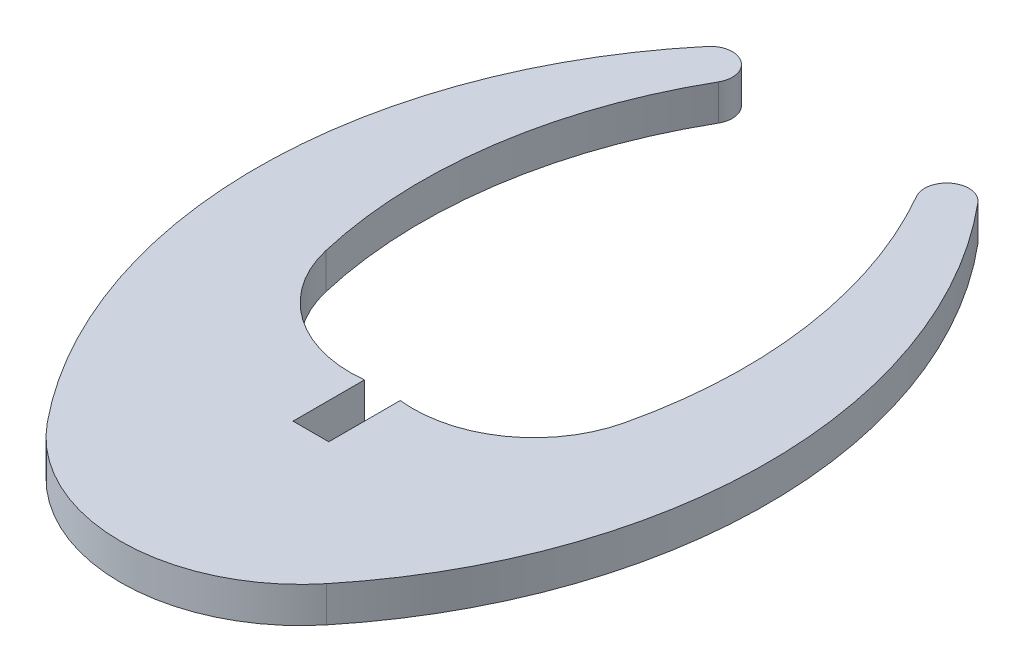
ISO-10303-21;
HEADER;
FILE_DESCRIPTION(('STEP AP214'),'2;1');
FILE_NAME('part.step','',(''),(''),'','','');
FILE_SCHEMA(('AUTOMOTIVE_DESIGN { 1 0 10303 214 1 1 1 1 }'));
ENDSEC;
DATA;
#1=APPLICATION_CONTEXT('core data for automotive mechanical design processes');
#2=APPLICATION_PROTOCOL_DEFINITION('international standard','automotive_design',2000,#1);
#3=PRODUCT_CONTEXT('',#1,'mechanical');
#4=PRODUCT('Part','Part','',(#3));
#5=PRODUCT_RELATED_PRODUCT_CATEGORY('part','',(#4));
#6=PRODUCT_DEFINITION_FORMATION('','',#4);
#7=PRODUCT_DEFINITION_CONTEXT('part definition',#1,'design');
#8=PRODUCT_DEFINITION('design','',#6,#7);
#9=PRODUCT_DEFINITION_SHAPE('','',#8);
#10=(LENGTH_UNIT() NAMED_UNIT(*) SI_UNIT(.MILLI.,.METRE.));
#11=(NAMED_UNIT(*) PLANE_ANGLE_UNIT() SI_UNIT($,.RADIAN.));
#12=(NAMED_UNIT(*) SI_UNIT($,.STERADIAN.) SOLID_ANGLE_UNIT());
#13=UNCERTAINTY_MEASURE_WITH_UNIT(LENGTH_MEASURE(1.E-05),#10,'distance_accuracy_value','');
#14=(GEOMETRIC_REPRESENTATION_CONTEXT(3) GLOBAL_UNCERTAINTY_ASSIGNED_CONTEXT((#13)) GLOBAL_UNIT_ASSIGNED_CONTEXT((#10,
#11,#12)) REPRESENTATION_CONTEXT('',''));
#15=CARTESIAN_POINT('',(0.,0.,0.));
#16=DIRECTION('',(0.,0.,1.));
#17=DIRECTION('',(1.,0.,0.));
#18=AXIS2_PLACEMENT_3D('',#15,#16,#17);
#19=CARTESIAN_POINT('',(-41945.935572,3.,-18357.862013));
#20=DIRECTION('',(-0.999999945672354,0.,0.000329629018519871));
#21=DIRECTION('',(0.000329629018519871,0.,0.999999945672354));
#22=AXIS2_PLACEMENT_3D('',#19,#20,#21);
#23=PLANE('',#22);
#24=DIRECTION('',(-0.000329629018519871,0.,-0.999999945672354));
#25=VECTOR('',#24,1.);
#26=CARTESIAN_POINT('',(-41945.935572,0.,-18357.862013));
#27=LINE('',#26,#25);
#28=CARTESIAN_POINT('',(-41945.933594,0.,-18351.861328));
#29=VERTEX_POINT('',#28);
#30=CARTESIAN_POINT('',(-41945.935572,0.,-18357.862013));
#31=VERTEX_POINT('',#30);
#32=EDGE_CURVE('E155',#29,#31,#27,.T.);
#33=ORIENTED_EDGE('',*,*,#32,.T.);
#34=DIRECTION('',(0.,-1.,0.));
#35=VECTOR('',#34,1.);
#36=CARTESIAN_POINT('',(-41945.935572,3.,-18357.862013));
#37=LINE('',#36,#35);
#38=CARTESIAN_POINT('',(-41945.935572,3.,-18357.862013));
#39=VERTEX_POINT('',#38);
#40=EDGE_CURVE('E11',#39,#31,#37,.T.);
#41=ORIENTED_EDGE('',*,*,#40,.F.);
#42=DIRECTION('',(-0.000329629018519871,0.,-0.999999945672354));
#43=VECTOR('',#42,1.);
#44=CARTESIAN_POINT('',(-41945.935572,3.,-18357.862013));
#45=LINE('',#44,#43);
#46=CARTESIAN_POINT('',(-41945.933594,3.,-18351.861328));
#47=VERTEX_POINT('',#46);
#48=EDGE_CURVE('E177',#47,#39,#45,.T.);
#49=ORIENTED_EDGE('',*,*,#48,.F.);
#50=DIRECTION('',(0.,-1.,0.));
#51=VECTOR('',#50,1.);
#52=CARTESIAN_POINT('',(-41945.933594,3.,-18351.861328));
#53=LINE('',#52,#51);
#54=EDGE_CURVE('E151',#47,#29,#53,.T.);
#55=ORIENTED_EDGE('',*,*,#54,.T.);
#56=EDGE_LOOP('',(#33,#41,#49,#55));
#57=FACE_BOUND('',#56,.T.);
#58=ADVANCED_FACE('F35',(#57),#23,.F.);
#59=CARTESIAN_POINT('',(-41947.0649977275,3.,-18367.9618966226));
#60=DIRECTION('',(0.,-1.,0.));
#61=DIRECTION('',(0.,0.,-1.));
#62=AXIS2_PLACEMENT_3D('',#59,#60,#61);
#63=CYLINDRICAL_SURFACE('',#62,10.1628367922054);
#64=CARTESIAN_POINT('',(-41947.0649977275,0.,-18367.9618966226));
#65=DIRECTION('',(0.,-1.,0.));
#66=DIRECTION('',(0.,0.,1.));
#67=AXIS2_PLACEMENT_3D('',#64,#65,#66);
#68=CIRCLE('',#67,10.1628367922054);
#69=CARTESIAN_POINT('',(-41956.960626,0.,-18365.646774));
#70=VERTEX_POINT('',#69);
#71=EDGE_CURVE('E158',#31,#70,#68,.T.);
#72=ORIENTED_EDGE('',*,*,#71,.T.);
#73=DIRECTION('',(0.,-1.,0.));
#74=VECTOR('',#73,1.);
#75=CARTESIAN_POINT('',(-41956.960626,3.,-18365.646774));
#76=LINE('',#75,#74);
#77=CARTESIAN_POINT('',(-41956.960626,3.,-18365.646774));
#78=VERTEX_POINT('',#77);
#79=EDGE_CURVE('E43',#78,#70,#76,.T.);
#80=ORIENTED_EDGE('',*,*,#79,.F.);
#81=CARTESIAN_POINT('',(-41947.0649977275,3.,-18367.9618966226));
#82=DIRECTION('',(0.,-1.,0.));
#83=DIRECTION('',(0.,0.,1.));
#84=AXIS2_PLACEMENT_3D('',#81,#82,#83);
#85=CIRCLE('',#84,10.1628367922054);
#86=EDGE_CURVE('E106',#39,#78,#85,.T.);
#87=ORIENTED_EDGE('',*,*,#86,.F.);
#88=ORIENTED_EDGE('',*,*,#40,.T.);
#89=EDGE_LOOP('',(#72,#80,#87,#88));
#90=FACE_BOUND('',#89,.T.);
#91=ADVANCED_FACE('F255',(#90),#63,.F.);
#92=CARTESIAN_POINT('',(-41918.4104897131,3.,-18374.6735051959));
#93=DIRECTION('',(0.,-1.,0.));
#94=DIRECTION('',(0.,0.,-1.));
#95=AXIS2_PLACEMENT_3D('',#92,#93,#94);
#96=CYLINDRICAL_SURFACE('',#95,39.592864051801);
#97=CARTESIAN_POINT('',(-41918.4104897131,0.,-18374.6735051959));
#98=DIRECTION('',(0.,-1.,0.));
#99=DIRECTION('',(0.,0.,1.));
#100=AXIS2_PLACEMENT_3D('',#97,#98,#99);
#101=CIRCLE('',#100,39.592864051801);
#102=CARTESIAN_POINT('',(-41952.74617,0.,-18394.387864));
#103=VERTEX_POINT('',#102);
#104=EDGE_CURVE('E160',#70,#103,#101,.T.);
#105=ORIENTED_EDGE('',*,*,#104,.T.);
#106=DIRECTION('',(0.,-1.,0.));
#107=VECTOR('',#106,1.);
#108=CARTESIAN_POINT('',(-41952.74617,3.,-18394.387864));
#109=LINE('',#108,#107);
#110=CARTESIAN_POINT('',(-41952.74617,3.,-18394.387864));
#111=VERTEX_POINT('',#110);
#112=EDGE_CURVE('E196',#111,#103,#109,.T.);
#113=ORIENTED_EDGE('',*,*,#112,.F.);
#114=CARTESIAN_POINT('',(-41918.4104897131,3.,-18374.6735051959));
#115=DIRECTION('',(0.,-1.,0.));
#116=DIRECTION('',(0.,0.,1.));
#117=AXIS2_PLACEMENT_3D('',#114,#115,#116);
#118=CIRCLE('',#117,39.592864051801);
#119=EDGE_CURVE('E204',#78,#111,#118,.T.);
#120=ORIENTED_EDGE('',*,*,#119,.F.);
#121=ORIENTED_EDGE('',*,*,#79,.T.);
#122=EDGE_LOOP('',(#105,#113,#120,#121));
#123=FACE_BOUND('',#122,.T.);
#124=ADVANCED_FACE('F202',(#123),#96,.F.);
#125=CARTESIAN_POINT('',(-41954.3597937934,3.,-18395.3127918622));
#126=DIRECTION('',(0.,-1.,0.));
#127=DIRECTION('',(0.,0.,-1.));
#128=AXIS2_PLACEMENT_3D('',#125,#126,#127);
#129=CYLINDRICAL_SURFACE('',#128,1.85991217449963);
#130=CARTESIAN_POINT('',(-41954.3597937934,0.,-18395.3127918622));
#131=DIRECTION('',(0.,1.,0.));
#132=DIRECTION('',(0.,0.,1.));
#133=AXIS2_PLACEMENT_3D('',#130,#131,#132);
#134=CIRCLE('',#133,1.85991217449963);
#135=CARTESIAN_POINT('',(-41955.786134,0.,-18396.506453));
#136=VERTEX_POINT('',#135);
#137=EDGE_CURVE('E162',#103,#136,#134,.T.);
#138=ORIENTED_EDGE('',*,*,#137,.T.);
#139=DIRECTION('',(0.,-1.,0.));
#140=VECTOR('',#139,1.);
#141=CARTESIAN_POINT('',(-41955.786134,3.,-18396.506453));
#142=LINE('',#141,#140);
#143=CARTESIAN_POINT('',(-41955.786134,3.,-18396.506453));
#144=VERTEX_POINT('',#143);
#145=EDGE_CURVE('E193',#144,#136,#142,.T.);
#146=ORIENTED_EDGE('',*,*,#145,.F.);
#147=CARTESIAN_POINT('',(-41954.3597937934,3.,-18395.3127918622));
#148=DIRECTION('',(0.,1.,0.));
#149=DIRECTION('',(0.,0.,1.));
#150=AXIS2_PLACEMENT_3D('',#147,#148,#149);
#151=CIRCLE('',#150,1.85991217449963);
#152=EDGE_CURVE('E222',#111,#144,#151,.T.);
#153=ORIENTED_EDGE('',*,*,#152,.F.);
#154=ORIENTED_EDGE('',*,*,#112,.T.);
#155=EDGE_LOOP('',(#138,#146,#153,#154));
#156=FACE_BOUND('',#155,.T.);
#157=ADVANCED_FACE('F213',(#156),#129,.T.);
#158=CARTESIAN_POINT('',(-41922.6640580123,3.,-18368.7544924463));
#159=DIRECTION('',(0.,-1.,0.));
#160=DIRECTION('',(0.,0.,-1.));
#161=AXIS2_PLACEMENT_3D('',#158,#159,#160);
#162=CYLINDRICAL_SURFACE('',#161,43.2116099249961);
#163=CARTESIAN_POINT('',(-41922.6640580123,0.,-18368.7544924463));
#164=DIRECTION('',(0.,1.,0.));
#165=DIRECTION('',(0.,0.,1.));
#166=AXIS2_PLACEMENT_3D('',#163,#164,#165);
#167=CIRCLE('',#166,43.2116099249961);
#168=CARTESIAN_POINT('',(-41956.160465,0.,-18341.455519));
#169=VERTEX_POINT('',#168);
#170=EDGE_CURVE('E164',#136,#169,#167,.T.);
#171=ORIENTED_EDGE('',*,*,#170,.T.);
#172=DIRECTION('',(0.,-1.,0.));
#173=VECTOR('',#172,1.);
#174=CARTESIAN_POINT('',(-41956.160465,3.,-18341.455519));
#175=LINE('',#174,#173);
#176=CARTESIAN_POINT('',(-41956.160465,3.,-18341.455519));
#177=VERTEX_POINT('',#176);
#178=EDGE_CURVE('E190',#177,#169,#175,.T.);
#179=ORIENTED_EDGE('',*,*,#178,.F.);
#180=CARTESIAN_POINT('',(-41922.6640580123,3.,-18368.7544924463));
#181=DIRECTION('',(0.,1.,0.));
#182=DIRECTION('',(0.,0.,1.));
#183=AXIS2_PLACEMENT_3D('',#180,#181,#182);
#184=CIRCLE('',#183,43.2116099249961);
#185=EDGE_CURVE('E219',#144,#177,#184,.T.);
#186=ORIENTED_EDGE('',*,*,#185,.F.);
#187=ORIENTED_EDGE('',*,*,#145,.T.);
#188=EDGE_LOOP('',(#171,#179,#186,#187));
#189=FACE_BOUND('',#188,.T.);
#190=ADVANCED_FACE('F217',(#189),#162,.T.);
#191=CARTESIAN_POINT('',(-41944.434343472,3.,-18351.0136722325));
#192=DIRECTION('',(0.,-1.,0.));
#193=DIRECTION('',(0.,0.,-1.));
#194=AXIS2_PLACEMENT_3D('',#191,#192,#193);
#195=CYLINDRICAL_SURFACE('',#194,15.1281267612989);
#196=CARTESIAN_POINT('',(-41944.434343472,0.,-18351.0136722325));
#197=DIRECTION('',(0.,1.,0.));
#198=DIRECTION('',(0.,0.,1.));
#199=AXIS2_PLACEMENT_3D('',#196,#197,#198);
#200=CIRCLE('',#199,15.1281267612989);
#201=CARTESIAN_POINT('',(-41932.710314,0.,-18341.452953));
#202=VERTEX_POINT('',#201);
#203=EDGE_CURVE('E166',#169,#202,#200,.T.);
#204=ORIENTED_EDGE('',*,*,#203,.T.);
#205=DIRECTION('',(0.,-1.,0.));
#206=VECTOR('',#205,1.);
#207=CARTESIAN_POINT('',(-41932.710314,3.,-18341.452953));
#208=LINE('',#207,#206);
#209=CARTESIAN_POINT('',(-41932.710314,3.,-18341.452953));
#210=VERTEX_POINT('',#209);
#211=EDGE_CURVE('E187',#210,#202,#208,.T.);
#212=ORIENTED_EDGE('',*,*,#211,.F.);
#213=CARTESIAN_POINT('',(-41944.434343472,3.,-18351.0136722325));
#214=DIRECTION('',(0.,1.,0.));
#215=DIRECTION('',(0.,0.,1.));
#216=AXIS2_PLACEMENT_3D('',#213,#214,#215);
#217=CIRCLE('',#216,15.1281267612989);
#218=EDGE_CURVE('E221',#177,#210,#217,.T.);
#219=ORIENTED_EDGE('',*,*,#218,.F.);
#220=ORIENTED_EDGE('',*,*,#178,.T.);
#221=EDGE_LOOP('',(#204,#212,#219,#220));
#222=FACE_BOUND('',#221,.T.);
#223=ADVANCED_FACE('F268',(#222),#195,.T.);
#224=CARTESIAN_POINT('',(-41966.1992058414,3.,-18368.7597147322));
#225=DIRECTION('',(0.,-1.,0.));
#226=DIRECTION('',(0.,0.,-1.));
#227=AXIS2_PLACEMENT_3D('',#224,#225,#226);
#228=CYLINDRICAL_SURFACE('',#227,43.2107060005989);
#229=CARTESIAN_POINT('',(-41966.1992058414,0.,-18368.7597147322));
#230=DIRECTION('',(0.,1.,0.));
#231=DIRECTION('',(0.,0.,1.));
#232=AXIS2_PLACEMENT_3D('',#229,#230,#231);
#233=CIRCLE('',#232,43.2107060005989);
#234=CARTESIAN_POINT('',(-41933.071738,0.,-18396.503831));
#235=VERTEX_POINT('',#234);
#236=EDGE_CURVE('E168',#202,#235,#233,.T.);
#237=ORIENTED_EDGE('',*,*,#236,.T.);
#238=DIRECTION('',(0.,-1.,0.));
#239=VECTOR('',#238,1.);
#240=CARTESIAN_POINT('',(-41933.071738,3.,-18396.503831));
#241=LINE('',#240,#239);
#242=CARTESIAN_POINT('',(-41933.071738,3.,-18396.503831));
#243=VERTEX_POINT('',#242);
#244=EDGE_CURVE('E184',#243,#235,#241,.T.);
#245=ORIENTED_EDGE('',*,*,#244,.F.);
#246=CARTESIAN_POINT('',(-41966.1992058414,3.,-18368.7597147322));
#247=DIRECTION('',(0.,1.,0.));
#248=DIRECTION('',(0.,0.,1.));
#249=AXIS2_PLACEMENT_3D('',#246,#247,#248);
#250=CIRCLE('',#249,43.2107060005989);
#251=EDGE_CURVE('E224',#210,#243,#250,.T.);
#252=ORIENTED_EDGE('',*,*,#251,.F.);
#253=ORIENTED_EDGE('',*,*,#211,.T.);
#254=EDGE_LOOP('',(#237,#245,#252,#253));
#255=FACE_BOUND('',#254,.T.);
#256=ADVANCED_FACE('F271',(#255),#228,.T.);
#257=CARTESIAN_POINT('',(-41934.4943927773,3.,-18395.3097814049));
#258=DIRECTION('',(0.,-1.,0.));
#259=DIRECTION('',(0.,0.,-1.));
#260=AXIS2_PLACEMENT_3D('',#257,#258,#259);
#261=CYLINDRICAL_SURFACE('',#260,1.85733708607009);
#262=CARTESIAN_POINT('',(-41934.4943927773,0.,-18395.3097814049));
#263=DIRECTION('',(0.,1.,0.));
#264=DIRECTION('',(0.,0.,1.));
#265=AXIS2_PLACEMENT_3D('',#262,#263,#264);
#266=CIRCLE('',#265,1.85733708607009);
#267=CARTESIAN_POINT('',(-41936.105791,0.,-18394.386149));
#268=VERTEX_POINT('',#267);
#269=EDGE_CURVE('E170',#235,#268,#266,.T.);
#270=ORIENTED_EDGE('',*,*,#269,.T.);
#271=DIRECTION('',(0.,-1.,0.));
#272=VECTOR('',#271,1.);
#273=CARTESIAN_POINT('',(-41936.105791,3.,-18394.386149));
#274=LINE('',#273,#272);
#275=CARTESIAN_POINT('',(-41936.105791,3.,-18394.386149));
#276=VERTEX_POINT('',#275);
#277=EDGE_CURVE('E181',#276,#268,#274,.T.);
#278=ORIENTED_EDGE('',*,*,#277,.F.);
#279=CARTESIAN_POINT('',(-41934.4943927773,3.,-18395.3097814049));
#280=DIRECTION('',(0.,1.,0.));
#281=DIRECTION('',(0.,0.,1.));
#282=AXIS2_PLACEMENT_3D('',#279,#280,#281);
#283=CIRCLE('',#282,1.85733708607009);
#284=EDGE_CURVE('E230',#243,#276,#283,.T.);
#285=ORIENTED_EDGE('',*,*,#284,.F.);
#286=ORIENTED_EDGE('',*,*,#244,.T.);
#287=EDGE_LOOP('',(#270,#278,#285,#286));
#288=FACE_BOUND('',#287,.T.);
#289=ADVANCED_FACE('F236',(#288),#261,.T.);
#290=CARTESIAN_POINT('',(-41970.4499157356,3.,-18374.6883607729));
#291=DIRECTION('',(0.,-1.,0.));
#292=DIRECTION('',(0.,0.,-1.));
#293=AXIS2_PLACEMENT_3D('',#290,#291,#292);
#294=CYLINDRICAL_SURFACE('',#293,39.591940655899);
#295=CARTESIAN_POINT('',(-41970.4499157356,0.,-18374.6883607729));
#296=DIRECTION('',(0.,-1.,0.));
#297=DIRECTION('',(0.,0.,1.));
#298=AXIS2_PLACEMENT_3D('',#295,#296,#297);
#299=CIRCLE('',#298,39.591940655899);
#300=CARTESIAN_POINT('',(-41931.904757,0.,-18365.64444));
#301=VERTEX_POINT('',#300);
#302=EDGE_CURVE('E172',#268,#301,#299,.T.);
#303=ORIENTED_EDGE('',*,*,#302,.T.);
#304=DIRECTION('',(0.,-1.,0.));
#305=VECTOR('',#304,1.);
#306=CARTESIAN_POINT('',(-41931.904757,3.,-18365.64444));
#307=LINE('',#306,#305);
#308=CARTESIAN_POINT('',(-41931.904757,3.,-18365.64444));
#309=VERTEX_POINT('',#308);
#310=EDGE_CURVE('E146',#309,#301,#307,.T.);
#311=ORIENTED_EDGE('',*,*,#310,.F.);
#312=CARTESIAN_POINT('',(-41970.4499157356,3.,-18374.6883607729));
#313=DIRECTION('',(0.,-1.,0.));
#314=DIRECTION('',(0.,0.,1.));
#315=AXIS2_PLACEMENT_3D('',#312,#313,#314);
#316=CIRCLE('',#315,39.591940655899);
#317=EDGE_CURVE('E137',#276,#309,#316,.T.);
#318=ORIENTED_EDGE('',*,*,#317,.F.);
#319=ORIENTED_EDGE('',*,*,#277,.T.);
#320=EDGE_LOOP('',(#303,#311,#318,#319));
#321=FACE_BOUND('',#320,.T.);
#322=ADVANCED_FACE('F240',(#321),#294,.F.);
#323=CARTESIAN_POINT('',(-41941.8013358641,3.,-18367.9624994293));
#324=DIRECTION('',(0.,-1.,0.));
#325=DIRECTION('',(0.,0.,-1.));
#326=AXIS2_PLACEMENT_3D('',#323,#324,#325);
#327=CYLINDRICAL_SURFACE('',#326,10.1644317466026);
#328=CARTESIAN_POINT('',(-41941.8013358641,0.,-18367.9624994293));
#329=DIRECTION('',(0.,-1.,0.));
#330=DIRECTION('',(0.,0.,1.));
#331=AXIS2_PLACEMENT_3D('',#328,#329,#330);
#332=CIRCLE('',#331,10.1644317466026);
#333=CARTESIAN_POINT('',(-41942.933594,0.,-18357.861328));
#334=VERTEX_POINT('',#333);
#335=EDGE_CURVE('E145',#301,#334,#332,.T.);
#336=ORIENTED_EDGE('',*,*,#335,.T.);
#337=DIRECTION('',(0.,-1.,0.));
#338=VECTOR('',#337,1.);
#339=CARTESIAN_POINT('',(-41942.933594,3.,-18357.861328));
#340=LINE('',#339,#338);
#341=CARTESIAN_POINT('',(-41942.933594,3.,-18357.861328));
#342=VERTEX_POINT('',#341);
#343=EDGE_CURVE('E142',#342,#334,#340,.T.);
#344=ORIENTED_EDGE('',*,*,#343,.F.);
#345=CARTESIAN_POINT('',(-41941.8013358641,3.,-18367.9624994293));
#346=DIRECTION('',(0.,-1.,0.));
#347=DIRECTION('',(0.,0.,1.));
#348=AXIS2_PLACEMENT_3D('',#345,#346,#347);
#349=CIRCLE('',#348,10.1644317466026);
#350=EDGE_CURVE('E131',#309,#342,#349,.T.);
#351=ORIENTED_EDGE('',*,*,#350,.F.);
#352=ORIENTED_EDGE('',*,*,#310,.T.);
#353=EDGE_LOOP('',(#336,#344,#351,#352));
#354=FACE_BOUND('',#353,.T.);
#355=ADVANCED_FACE('F143',(#354),#327,.F.);
#356=CARTESIAN_POINT('',(-41942.933594,3.,-18351.861328));
#357=DIRECTION('',(1.,0.,0.));
#358=DIRECTION('',(0.,0.,-1.));
#359=AXIS2_PLACEMENT_3D('',#356,#357,#358);
#360=PLANE('',#359);
#361=DIRECTION('',(0.,0.,1.));
#362=VECTOR('',#361,1.);
#363=CARTESIAN_POINT('',(-41942.933594,0.,-18351.861328));
#364=LINE('',#363,#362);
#365=CARTESIAN_POINT('',(-41942.933594,0.,-18351.861328));
#366=VERTEX_POINT('',#365);
#367=EDGE_CURVE('E92',#334,#366,#364,.T.);
#368=ORIENTED_EDGE('',*,*,#367,.T.);
#369=DIRECTION('',(0.,-1.,0.));
#370=VECTOR('',#369,1.);
#371=CARTESIAN_POINT('',(-41942.933594,3.,-18351.861328));
#372=LINE('',#371,#370);
#373=CARTESIAN_POINT('',(-41942.933594,3.,-18351.861328));
#374=VERTEX_POINT('',#373);
#375=EDGE_CURVE('E147',#374,#366,#372,.T.);
#376=ORIENTED_EDGE('',*,*,#375,.F.);
#377=DIRECTION('',(0.,0.,1.));
#378=VECTOR('',#377,1.);
#379=CARTESIAN_POINT('',(-41942.933594,3.,-18351.861328));
#380=LINE('',#379,#378);
#381=EDGE_CURVE('E135',#342,#374,#380,.T.);
#382=ORIENTED_EDGE('',*,*,#381,.F.);
#383=ORIENTED_EDGE('',*,*,#343,.T.);
#384=EDGE_LOOP('',(#368,#376,#382,#383));
#385=FACE_BOUND('',#384,.T.);
#386=ADVANCED_FACE('F149',(#385),#360,.F.);
#387=CARTESIAN_POINT('',(-41945.933594,3.,-18351.861328));
#388=DIRECTION('',(0.,0.,1.));
#389=DIRECTION('',(1.,0.,0.));
#390=AXIS2_PLACEMENT_3D('',#387,#388,#389);
#391=PLANE('',#390);
#392=DIRECTION('',(-1.,0.,0.));
#393=VECTOR('',#392,1.);
#394=CARTESIAN_POINT('',(-41945.933594,0.,-18351.861328));
#395=LINE('',#394,#393);
#396=EDGE_CURVE('E98',#366,#29,#395,.T.);
#397=ORIENTED_EDGE('',*,*,#396,.T.);
#398=ORIENTED_EDGE('',*,*,#54,.F.);
#399=DIRECTION('',(-1.,0.,0.));
#400=VECTOR('',#399,1.);
#401=CARTESIAN_POINT('',(-41945.933594,3.,-18351.861328));
#402=LINE('',#401,#400);
#403=EDGE_CURVE('E51',#374,#47,#402,.T.);
#404=ORIENTED_EDGE('',*,*,#403,.F.);
#405=ORIENTED_EDGE('',*,*,#375,.T.);
#406=EDGE_LOOP('',(#397,#398,#404,#405));
#407=FACE_BOUND('',#406,.T.);
#408=ADVANCED_FACE('F244',(#407),#391,.F.);
#409=CARTESIAN_POINT('',(-41941.8013358641,3.,-18367.9624994293));
#410=DIRECTION('',(0.,1.,0.));
#411=DIRECTION('',(0.,0.,1.));
#412=AXIS2_PLACEMENT_3D('',#409,#410,#411);
#413=PLANE('',#412);
#414=ORIENTED_EDGE('',*,*,#48,.T.);
#415=ORIENTED_EDGE('',*,*,#86,.T.);
#416=ORIENTED_EDGE('',*,*,#119,.T.);
#417=ORIENTED_EDGE('',*,*,#152,.T.);
#418=ORIENTED_EDGE('',*,*,#185,.T.);
#419=ORIENTED_EDGE('',*,*,#218,.T.);
#420=ORIENTED_EDGE('',*,*,#251,.T.);
#421=ORIENTED_EDGE('',*,*,#284,.T.);
#422=ORIENTED_EDGE('',*,*,#317,.T.);
#423=ORIENTED_EDGE('',*,*,#350,.T.);
#424=ORIENTED_EDGE('',*,*,#381,.T.);
#425=ORIENTED_EDGE('',*,*,#403,.T.);
#426=EDGE_LOOP('',(#414,#415,#416,#417,#418,#419,#420,#421,#422,#423,#424,#425));
#427=FACE_BOUND('',#426,.T.);
#428=ADVANCED_FACE('F133',(#427),#413,.T.);
#429=CARTESIAN_POINT('',(-41941.8013358641,0.,-18367.9624994293));
#430=DIRECTION('',(0.,1.,0.));
#431=DIRECTION('',(0.,0.,1.));
#432=AXIS2_PLACEMENT_3D('',#429,#430,#431);
#433=PLANE('',#432);
#434=ORIENTED_EDGE('',*,*,#32,.F.);
#435=ORIENTED_EDGE('',*,*,#396,.F.);
#436=ORIENTED_EDGE('',*,*,#367,.F.);
#437=ORIENTED_EDGE('',*,*,#335,.F.);
#438=ORIENTED_EDGE('',*,*,#302,.F.);
#439=ORIENTED_EDGE('',*,*,#269,.F.);
#440=ORIENTED_EDGE('',*,*,#236,.F.);
#441=ORIENTED_EDGE('',*,*,#203,.F.);
#442=ORIENTED_EDGE('',*,*,#170,.F.);
#443=ORIENTED_EDGE('',*,*,#137,.F.);
#444=ORIENTED_EDGE('',*,*,#104,.F.);
#445=ORIENTED_EDGE('',*,*,#71,.F.);
#446=EDGE_LOOP('',(#434,#435,#436,#437,#438,#439,#440,#441,#442,#443,#444,#445));
#447=FACE_BOUND('',#446,.T.);
#448=ADVANCED_FACE('F208',(#447),#433,.F.);
#449=CLOSED_SHELL('',(#58,#91,#124,#157,#190,#223,#256,#289,#322,#355,#386,#408,#428,#448));
#450=MANIFOLD_SOLID_BREP('B2',#449);
#451=ADVANCED_BREP_SHAPE_REPRESENTATION('',(#18,#450),#14);
#452=SHAPE_DEFINITION_REPRESENTATION(#9,#451);
ENDSEC;
END-ISO-10303-21;
